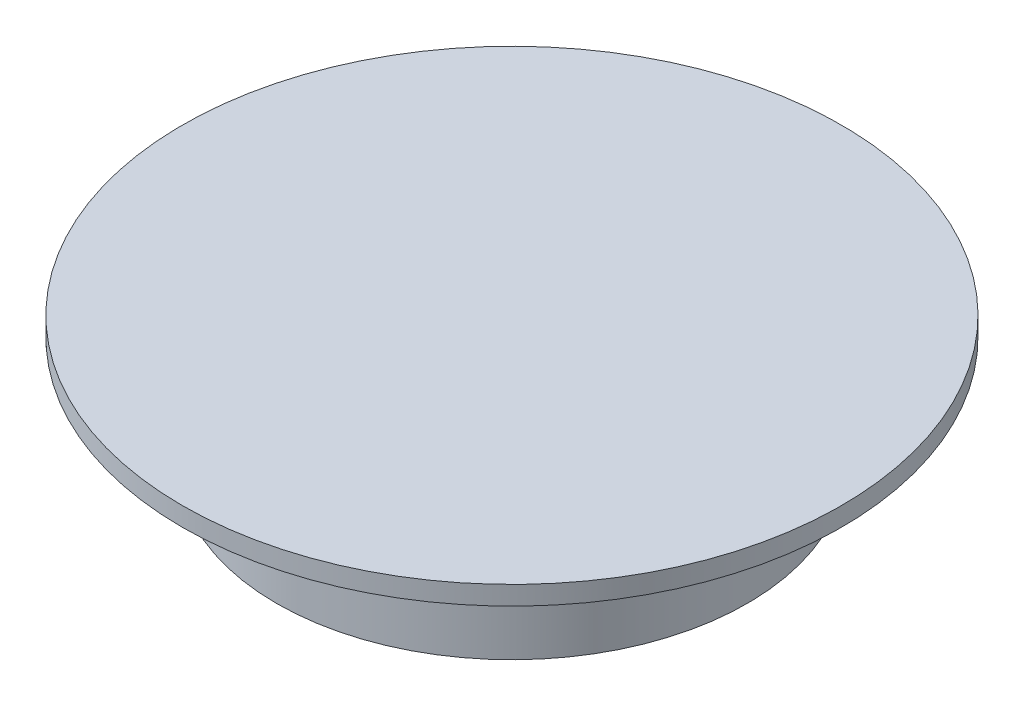
ISO-10303-21;
HEADER;
FILE_DESCRIPTION(('STEP AP214'),'2;1');
FILE_NAME('part.step','',(''),(''),'','','');
FILE_SCHEMA(('AUTOMOTIVE_DESIGN { 1 0 10303 214 1 1 1 1 }'));
ENDSEC;
DATA;
#1=APPLICATION_CONTEXT('core data for automotive mechanical design processes');
#2=APPLICATION_PROTOCOL_DEFINITION('international standard','automotive_design',2000,#1);
#3=PRODUCT_CONTEXT('',#1,'mechanical');
#4=PRODUCT('Part','Part','',(#3));
#5=PRODUCT_RELATED_PRODUCT_CATEGORY('part','',(#4));
#6=PRODUCT_DEFINITION_FORMATION('','',#4);
#7=PRODUCT_DEFINITION_CONTEXT('part definition',#1,'design');
#8=PRODUCT_DEFINITION('design','',#6,#7);
#9=PRODUCT_DEFINITION_SHAPE('','',#8);
#10=(LENGTH_UNIT() NAMED_UNIT(*) SI_UNIT(.MILLI.,.METRE.));
#11=(NAMED_UNIT(*) PLANE_ANGLE_UNIT() SI_UNIT($,.RADIAN.));
#12=(NAMED_UNIT(*) SI_UNIT($,.STERADIAN.) SOLID_ANGLE_UNIT());
#13=UNCERTAINTY_MEASURE_WITH_UNIT(LENGTH_MEASURE(1.E-05),#10,'distance_accuracy_value','');
#14=(GEOMETRIC_REPRESENTATION_CONTEXT(3) GLOBAL_UNCERTAINTY_ASSIGNED_CONTEXT((#13)) GLOBAL_UNIT_ASSIGNED_CONTEXT((#10,
#11,#12)) REPRESENTATION_CONTEXT('',''));
#15=CARTESIAN_POINT('',(0.,0.,0.));
#16=DIRECTION('',(0.,0.,1.));
#17=DIRECTION('',(1.,0.,0.));
#18=AXIS2_PLACEMENT_3D('',#15,#16,#17);
#19=CARTESIAN_POINT('',(0.,7.,35.));
#20=DIRECTION('',(0.,1.,0.));
#21=DIRECTION('',(0.,0.,1.));
#22=AXIS2_PLACEMENT_3D('',#19,#20,#21);
#23=PLANE('',#22);
#24=CARTESIAN_POINT('',(0.,7.,0.));
#25=DIRECTION('',(0.,1.,0.));
#26=DIRECTION('',(0.,0.,1.));
#27=AXIS2_PLACEMENT_3D('',#24,#25,#26);
#28=CIRCLE('',#27,35.);
#29=CARTESIAN_POINT('',(0.,7.,35.));
#30=VERTEX_POINT('',#29);
#31=EDGE_CURVE('E45',#30,#30,#28,.T.);
#32=ORIENTED_EDGE('',*,*,#31,.T.);
#33=EDGE_LOOP('',(#32));
#34=FACE_BOUND('',#33,.T.);
#35=ADVANCED_FACE('F31',(#34),#23,.T.);
#36=CARTESIAN_POINT('',(0.,-7.,25.));
#37=DIRECTION('',(0.,-1.,0.));
#38=DIRECTION('',(0.,0.,-1.));
#39=AXIS2_PLACEMENT_3D('',#36,#37,#38);
#40=PLANE('',#39);
#41=CARTESIAN_POINT('',(0.,-7.,0.));
#42=DIRECTION('',(0.,1.,0.));
#43=DIRECTION('',(0.,0.,1.));
#44=AXIS2_PLACEMENT_3D('',#41,#42,#43);
#45=CIRCLE('',#44,25.);
#46=CARTESIAN_POINT('',(0.,-7.,25.));
#47=VERTEX_POINT('',#46);
#48=EDGE_CURVE('E10',#47,#47,#45,.T.);
#49=ORIENTED_EDGE('',*,*,#48,.F.);
#50=EDGE_LOOP('',(#49));
#51=FACE_BOUND('',#50,.T.);
#52=ADVANCED_FACE('F63',(#51),#40,.T.);
#53=CARTESIAN_POINT('',(0.,5.90243902439024,0.));
#54=DIRECTION('',(0.,1.,0.));
#55=DIRECTION('',(0.,0.,1.));
#56=AXIS2_PLACEMENT_3D('',#53,#54,#55);
#57=CYLINDRICAL_SURFACE('',#56,25.);
#58=ORIENTED_EDGE('',*,*,#48,.T.);
#59=EDGE_LOOP('',(#58));
#60=FACE_BOUND('',#59,.T.);
#61=CARTESIAN_POINT('',(0.,5.,0.));
#62=DIRECTION('',(0.,1.,0.));
#63=DIRECTION('',(0.,0.,1.));
#64=AXIS2_PLACEMENT_3D('',#61,#62,#63);
#65=CIRCLE('',#64,25.);
#66=CARTESIAN_POINT('',(0.,5.,25.));
#67=VERTEX_POINT('',#66);
#68=EDGE_CURVE('E37',#67,#67,#65,.T.);
#69=ORIENTED_EDGE('',*,*,#68,.F.);
#70=EDGE_LOOP('',(#69));
#71=FACE_BOUND('',#70,.T.);
#72=ADVANCED_FACE('F60',(#60,#71),#57,.T.);
#73=CARTESIAN_POINT('',(0.,5.,35.));
#74=DIRECTION('',(0.,-1.,0.));
#75=DIRECTION('',(0.,0.,-1.));
#76=AXIS2_PLACEMENT_3D('',#73,#74,#75);
#77=PLANE('',#76);
#78=ORIENTED_EDGE('',*,*,#68,.T.);
#79=EDGE_LOOP('',(#78));
#80=FACE_BOUND('',#79,.T.);
#81=CARTESIAN_POINT('',(0.,5.,0.));
#82=DIRECTION('',(0.,1.,0.));
#83=DIRECTION('',(0.,0.,1.));
#84=AXIS2_PLACEMENT_3D('',#81,#82,#83);
#85=CIRCLE('',#84,35.);
#86=CARTESIAN_POINT('',(0.,5.,35.));
#87=VERTEX_POINT('',#86);
#88=EDGE_CURVE('E41',#87,#87,#85,.T.);
#89=ORIENTED_EDGE('',*,*,#88,.F.);
#90=EDGE_LOOP('',(#89));
#91=FACE_BOUND('',#90,.T.);
#92=ADVANCED_FACE('F54',(#80,#91),#77,.T.);
#93=CARTESIAN_POINT('',(0.,5.90243902439024,0.));
#94=DIRECTION('',(0.,1.,0.));
#95=DIRECTION('',(0.,0.,1.));
#96=AXIS2_PLACEMENT_3D('',#93,#94,#95);
#97=CYLINDRICAL_SURFACE('',#96,35.);
#98=ORIENTED_EDGE('',*,*,#88,.T.);
#99=EDGE_LOOP('',(#98));
#100=FACE_BOUND('',#99,.T.);
#101=ORIENTED_EDGE('',*,*,#31,.F.);
#102=EDGE_LOOP('',(#101));
#103=FACE_BOUND('',#102,.T.);
#104=ADVANCED_FACE('F52',(#100,#103),#97,.T.);
#105=CLOSED_SHELL('',(#35,#52,#72,#92,#104));
#106=MANIFOLD_SOLID_BREP('B2',#105);
#107=ADVANCED_BREP_SHAPE_REPRESENTATION('',(#18,#106),#14);
#108=SHAPE_DEFINITION_REPRESENTATION(#9,#107);
ENDSEC;
END-ISO-10303-21;
